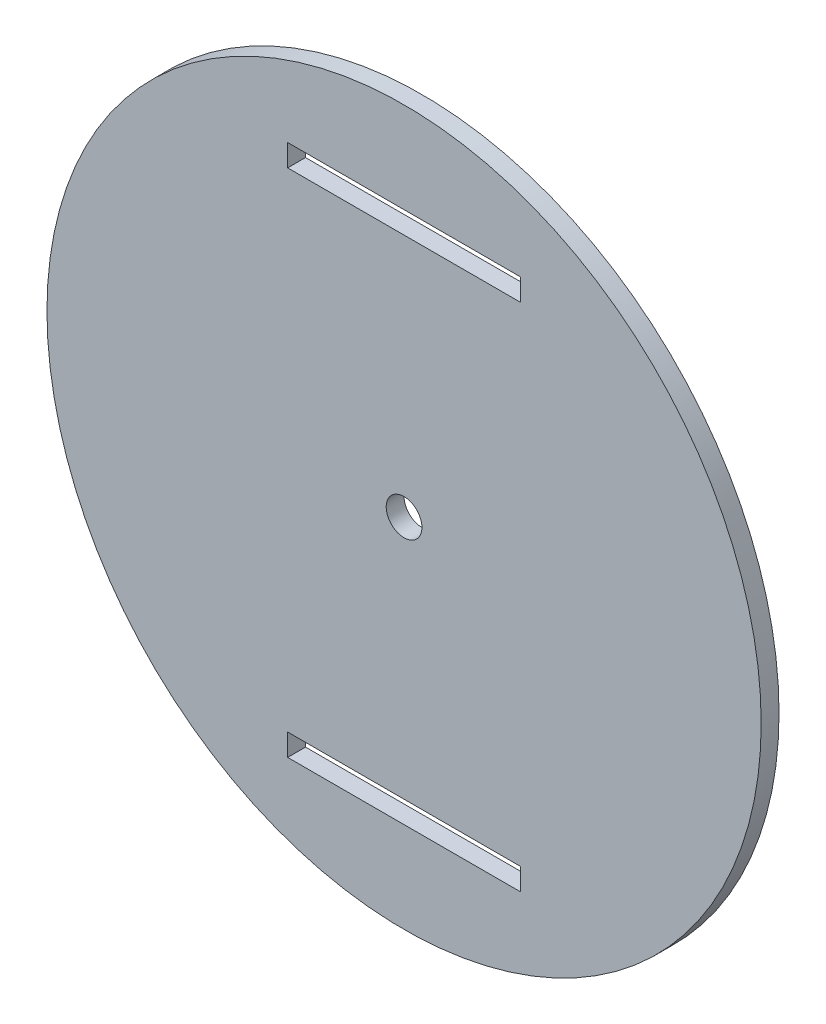
ISO-10303-21;
HEADER;
FILE_DESCRIPTION(('STEP AP214'),'2;1');
FILE_NAME('part.step','',(''),(''),'','','');
FILE_SCHEMA(('AUTOMOTIVE_DESIGN { 1 0 10303 214 1 1 1 1 }'));
ENDSEC;
DATA;
#1=APPLICATION_CONTEXT('core data for automotive mechanical design processes');
#2=APPLICATION_PROTOCOL_DEFINITION('international standard','automotive_design',2000,#1);
#3=PRODUCT_CONTEXT('',#1,'mechanical');
#4=PRODUCT('Part','Part','',(#3));
#5=PRODUCT_RELATED_PRODUCT_CATEGORY('part','',(#4));
#6=PRODUCT_DEFINITION_FORMATION('','',#4);
#7=PRODUCT_DEFINITION_CONTEXT('part definition',#1,'design');
#8=PRODUCT_DEFINITION('design','',#6,#7);
#9=PRODUCT_DEFINITION_SHAPE('','',#8);
#10=(LENGTH_UNIT() NAMED_UNIT(*) SI_UNIT(.MILLI.,.METRE.));
#11=(NAMED_UNIT(*) PLANE_ANGLE_UNIT() SI_UNIT($,.RADIAN.));
#12=(NAMED_UNIT(*) SI_UNIT($,.STERADIAN.) SOLID_ANGLE_UNIT());
#13=UNCERTAINTY_MEASURE_WITH_UNIT(LENGTH_MEASURE(1.E-05),#10,'distance_accuracy_value','');
#14=(GEOMETRIC_REPRESENTATION_CONTEXT(3) GLOBAL_UNCERTAINTY_ASSIGNED_CONTEXT((#13)) GLOBAL_UNIT_ASSIGNED_CONTEXT((#10,
#11,#12)) REPRESENTATION_CONTEXT('',''));
#15=CARTESIAN_POINT('',(0.,0.,0.));
#16=DIRECTION('',(0.,0.,1.));
#17=DIRECTION('',(1.,0.,0.));
#18=AXIS2_PLACEMENT_3D('',#15,#16,#17);
#19=CARTESIAN_POINT('',(0.,0.,1.));
#20=DIRECTION('',(0.,0.,-1.));
#21=DIRECTION('',(-1.,0.,0.));
#22=AXIS2_PLACEMENT_3D('',#19,#20,#21);
#23=CYLINDRICAL_SURFACE('',#22,20.);
#24=CARTESIAN_POINT('',(0.,0.,1.));
#25=DIRECTION('',(0.,0.,1.));
#26=DIRECTION('',(1.,0.,0.));
#27=AXIS2_PLACEMENT_3D('',#24,#25,#26);
#28=CIRCLE('',#27,20.);
#29=CARTESIAN_POINT('',(20.,0.,1.));
#30=VERTEX_POINT('',#29);
#31=EDGE_CURVE('E11',#30,#30,#28,.T.);
#32=ORIENTED_EDGE('',*,*,#31,.F.);
#33=EDGE_LOOP('',(#32));
#34=FACE_BOUND('',#33,.T.);
#35=CARTESIAN_POINT('',(0.,0.,0.));
#36=DIRECTION('',(0.,0.,1.));
#37=DIRECTION('',(1.,0.,0.));
#38=AXIS2_PLACEMENT_3D('',#35,#36,#37);
#39=CIRCLE('',#38,20.);
#40=CARTESIAN_POINT('',(20.,0.,0.));
#41=VERTEX_POINT('',#40);
#42=EDGE_CURVE('E37',#41,#41,#39,.T.);
#43=ORIENTED_EDGE('',*,*,#42,.T.);
#44=EDGE_LOOP('',(#43));
#45=FACE_BOUND('',#44,.T.);
#46=ADVANCED_FACE('F34',(#34,#45),#23,.T.);
#47=CARTESIAN_POINT('',(0.,0.,1.));
#48=DIRECTION('',(0.,0.,1.));
#49=DIRECTION('',(1.,0.,0.));
#50=AXIS2_PLACEMENT_3D('',#47,#48,#49);
#51=PLANE('',#50);
#52=CARTESIAN_POINT('',(0.,0.,1.));
#53=DIRECTION('',(0.,0.,1.));
#54=DIRECTION('',(1.,0.,0.));
#55=AXIS2_PLACEMENT_3D('',#52,#53,#54);
#56=CIRCLE('',#55,1.);
#57=CARTESIAN_POINT('',(1.,0.,1.));
#58=VERTEX_POINT('',#57);
#59=EDGE_CURVE('E125',#58,#58,#56,.T.);
#60=ORIENTED_EDGE('',*,*,#59,.F.);
#61=EDGE_LOOP('',(#60));
#62=FACE_BOUND('',#61,.T.);
#63=DIRECTION('',(0.,1.,0.));
#64=VECTOR('',#63,1.);
#65=CARTESIAN_POINT('',(6.51867331266451,14.9118149169536,1.));
#66=LINE('',#65,#64);
#67=CARTESIAN_POINT('',(6.51867331266451,13.6808208149912,1.));
#68=VERTEX_POINT('',#67);
#69=CARTESIAN_POINT('',(6.51867331266451,14.9118149169536,1.));
#70=VERTEX_POINT('',#69);
#71=EDGE_CURVE('E48',#68,#70,#66,.T.);
#72=ORIENTED_EDGE('',*,*,#71,.F.);
#73=DIRECTION('',(1.,0.,0.));
#74=VECTOR('',#73,1.);
#75=CARTESIAN_POINT('',(-6.51867331266451,13.6808208149912,1.));
#76=LINE('',#75,#74);
#77=CARTESIAN_POINT('',(-6.51867331266451,13.6808208149912,1.));
#78=VERTEX_POINT('',#77);
#79=EDGE_CURVE('E119',#78,#68,#76,.T.);
#80=ORIENTED_EDGE('',*,*,#79,.F.);
#81=DIRECTION('',(0.,-1.,0.));
#82=VECTOR('',#81,1.);
#83=CARTESIAN_POINT('',(-6.51867331266451,14.9118149169536,1.));
#84=LINE('',#83,#82);
#85=CARTESIAN_POINT('',(-6.51867331266451,14.9118149169536,1.));
#86=VERTEX_POINT('',#85);
#87=EDGE_CURVE('E122',#86,#78,#84,.T.);
#88=ORIENTED_EDGE('',*,*,#87,.F.);
#89=DIRECTION('',(-1.,0.,0.));
#90=VECTOR('',#89,1.);
#91=CARTESIAN_POINT('',(-6.51867331266451,14.9118149169536,1.));
#92=LINE('',#91,#90);
#93=EDGE_CURVE('E131',#70,#86,#92,.T.);
#94=ORIENTED_EDGE('',*,*,#93,.F.);
#95=EDGE_LOOP('',(#72,#80,#88,#94));
#96=FACE_BOUND('',#95,.T.);
#97=DIRECTION('',(0.,-1.,0.));
#98=VECTOR('',#97,1.);
#99=CARTESIAN_POINT('',(-6.51867331266451,-14.9118149169536,1.));
#100=LINE('',#99,#98);
#101=CARTESIAN_POINT('',(-6.51867331266451,-13.6808208149912,1.));
#102=VERTEX_POINT('',#101);
#103=CARTESIAN_POINT('',(-6.51867331266451,-14.9118149169536,1.));
#104=VERTEX_POINT('',#103);
#105=EDGE_CURVE('E56',#102,#104,#100,.T.);
#106=ORIENTED_EDGE('',*,*,#105,.F.);
#107=DIRECTION('',(-1.,0.,0.));
#108=VECTOR('',#107,1.);
#109=CARTESIAN_POINT('',(-6.51867331266451,-13.6808208149912,1.));
#110=LINE('',#109,#108);
#111=CARTESIAN_POINT('',(6.51867331266451,-13.6808208149912,1.));
#112=VERTEX_POINT('',#111);
#113=EDGE_CURVE('E145',#112,#102,#110,.T.);
#114=ORIENTED_EDGE('',*,*,#113,.F.);
#115=DIRECTION('',(0.,1.,0.));
#116=VECTOR('',#115,1.);
#117=CARTESIAN_POINT('',(6.51867331266451,-14.9118149169536,1.));
#118=LINE('',#117,#116);
#119=CARTESIAN_POINT('',(6.51867331266451,-14.9118149169536,1.));
#120=VERTEX_POINT('',#119);
#121=EDGE_CURVE('E160',#120,#112,#118,.T.);
#122=ORIENTED_EDGE('',*,*,#121,.F.);
#123=DIRECTION('',(1.,0.,0.));
#124=VECTOR('',#123,1.);
#125=CARTESIAN_POINT('',(-6.51867331266451,-14.9118149169536,1.));
#126=LINE('',#125,#124);
#127=EDGE_CURVE('E156',#104,#120,#126,.T.);
#128=ORIENTED_EDGE('',*,*,#127,.F.);
#129=EDGE_LOOP('',(#106,#114,#122,#128));
#130=FACE_BOUND('',#129,.T.);
#131=ORIENTED_EDGE('',*,*,#31,.T.);
#132=EDGE_LOOP('',(#131));
#133=FACE_BOUND('',#132,.T.);
#134=ADVANCED_FACE('F178',(#62,#96,#130,#133),#51,.T.);
#135=CARTESIAN_POINT('',(0.,0.,0.));
#136=DIRECTION('',(0.,0.,1.));
#137=DIRECTION('',(1.,0.,0.));
#138=AXIS2_PLACEMENT_3D('',#135,#136,#137);
#139=PLANE('',#138);
#140=CARTESIAN_POINT('',(0.,0.,0.));
#141=DIRECTION('',(0.,0.,1.));
#142=DIRECTION('',(1.,0.,0.));
#143=AXIS2_PLACEMENT_3D('',#140,#141,#142);
#144=CIRCLE('',#143,1.);
#145=CARTESIAN_POINT('',(1.,0.,0.));
#146=VERTEX_POINT('',#145);
#147=EDGE_CURVE('E157',#146,#146,#144,.T.);
#148=ORIENTED_EDGE('',*,*,#147,.T.);
#149=EDGE_LOOP('',(#148));
#150=FACE_BOUND('',#149,.T.);
#151=DIRECTION('',(1.,0.,0.));
#152=VECTOR('',#151,1.);
#153=CARTESIAN_POINT('',(-6.51867331266451,13.6808208149912,0.));
#154=LINE('',#153,#152);
#155=CARTESIAN_POINT('',(-6.51867331266451,13.6808208149912,0.));
#156=VERTEX_POINT('',#155);
#157=CARTESIAN_POINT('',(6.51867331266451,13.6808208149912,0.));
#158=VERTEX_POINT('',#157);
#159=EDGE_CURVE('E106',#156,#158,#154,.T.);
#160=ORIENTED_EDGE('',*,*,#159,.T.);
#161=DIRECTION('',(0.,1.,0.));
#162=VECTOR('',#161,1.);
#163=CARTESIAN_POINT('',(6.51867331266451,14.9118149169536,0.));
#164=LINE('',#163,#162);
#165=CARTESIAN_POINT('',(6.51867331266451,14.9118149169536,0.));
#166=VERTEX_POINT('',#165);
#167=EDGE_CURVE('E100',#158,#166,#164,.T.);
#168=ORIENTED_EDGE('',*,*,#167,.T.);
#169=DIRECTION('',(-1.,0.,0.));
#170=VECTOR('',#169,1.);
#171=CARTESIAN_POINT('',(-6.51867331266451,14.9118149169536,0.));
#172=LINE('',#171,#170);
#173=CARTESIAN_POINT('',(-6.51867331266451,14.9118149169536,0.));
#174=VERTEX_POINT('',#173);
#175=EDGE_CURVE('E110',#166,#174,#172,.T.);
#176=ORIENTED_EDGE('',*,*,#175,.T.);
#177=DIRECTION('',(0.,-1.,0.));
#178=VECTOR('',#177,1.);
#179=CARTESIAN_POINT('',(-6.51867331266451,14.9118149169536,0.));
#180=LINE('',#179,#178);
#181=EDGE_CURVE('E114',#174,#156,#180,.T.);
#182=ORIENTED_EDGE('',*,*,#181,.T.);
#183=EDGE_LOOP('',(#160,#168,#176,#182));
#184=FACE_BOUND('',#183,.T.);
#185=DIRECTION('',(-1.,0.,0.));
#186=VECTOR('',#185,1.);
#187=CARTESIAN_POINT('',(-6.51867331266451,-13.6808208149912,0.));
#188=LINE('',#187,#186);
#189=CARTESIAN_POINT('',(6.51867331266451,-13.6808208149912,0.));
#190=VERTEX_POINT('',#189);
#191=CARTESIAN_POINT('',(-6.51867331266451,-13.6808208149912,0.));
#192=VERTEX_POINT('',#191);
#193=EDGE_CURVE('E151',#190,#192,#188,.T.);
#194=ORIENTED_EDGE('',*,*,#193,.T.);
#195=DIRECTION('',(0.,-1.,0.));
#196=VECTOR('',#195,1.);
#197=CARTESIAN_POINT('',(-6.51867331266451,-14.9118149169536,0.));
#198=LINE('',#197,#196);
#199=CARTESIAN_POINT('',(-6.51867331266451,-14.9118149169536,0.));
#200=VERTEX_POINT('',#199);
#201=EDGE_CURVE('E141',#192,#200,#198,.T.);
#202=ORIENTED_EDGE('',*,*,#201,.T.);
#203=DIRECTION('',(1.,0.,0.));
#204=VECTOR('',#203,1.);
#205=CARTESIAN_POINT('',(-6.51867331266451,-14.9118149169536,0.));
#206=LINE('',#205,#204);
#207=CARTESIAN_POINT('',(6.51867331266451,-14.9118149169536,0.));
#208=VERTEX_POINT('',#207);
#209=EDGE_CURVE('E144',#200,#208,#206,.T.);
#210=ORIENTED_EDGE('',*,*,#209,.T.);
#211=DIRECTION('',(0.,1.,0.));
#212=VECTOR('',#211,1.);
#213=CARTESIAN_POINT('',(6.51867331266451,-14.9118149169536,0.));
#214=LINE('',#213,#212);
#215=EDGE_CURVE('E148',#208,#190,#214,.T.);
#216=ORIENTED_EDGE('',*,*,#215,.T.);
#217=EDGE_LOOP('',(#194,#202,#210,#216));
#218=FACE_BOUND('',#217,.T.);
#219=ORIENTED_EDGE('',*,*,#42,.F.);
#220=EDGE_LOOP('',(#219));
#221=FACE_BOUND('',#220,.T.);
#222=ADVANCED_FACE('F116',(#150,#184,#218,#221),#139,.F.);
#223=CARTESIAN_POINT('',(-6.51867331266451,-14.9118149169536,0.));
#224=DIRECTION('',(-1.,0.,0.));
#225=DIRECTION('',(0.,0.,1.));
#226=AXIS2_PLACEMENT_3D('',#223,#224,#225);
#227=PLANE('',#226);
#228=ORIENTED_EDGE('',*,*,#105,.T.);
#229=DIRECTION('',(0.,0.,1.));
#230=VECTOR('',#229,1.);
#231=CARTESIAN_POINT('',(-6.51867331266451,-14.9118149169536,0.));
#232=LINE('',#231,#230);
#233=EDGE_CURVE('E154',#200,#104,#232,.T.);
#234=ORIENTED_EDGE('',*,*,#233,.F.);
#235=ORIENTED_EDGE('',*,*,#201,.F.);
#236=DIRECTION('',(0.,0.,1.));
#237=VECTOR('',#236,1.);
#238=CARTESIAN_POINT('',(-6.51867331266451,-13.6808208149912,0.));
#239=LINE('',#238,#237);
#240=EDGE_CURVE('E132',#192,#102,#239,.T.);
#241=ORIENTED_EDGE('',*,*,#240,.T.);
#242=EDGE_LOOP('',(#228,#234,#235,#241));
#243=FACE_BOUND('',#242,.T.);
#244=ADVANCED_FACE('F185',(#243),#227,.F.);
#245=CARTESIAN_POINT('',(-6.51867331266451,-13.6808208149912,0.));
#246=DIRECTION('',(0.,1.,0.));
#247=DIRECTION('',(0.,0.,1.));
#248=AXIS2_PLACEMENT_3D('',#245,#246,#247);
#249=PLANE('',#248);
#250=ORIENTED_EDGE('',*,*,#113,.T.);
#251=ORIENTED_EDGE('',*,*,#240,.F.);
#252=ORIENTED_EDGE('',*,*,#193,.F.);
#253=DIRECTION('',(0.,0.,1.));
#254=VECTOR('',#253,1.);
#255=CARTESIAN_POINT('',(6.51867331266451,-13.6808208149912,0.));
#256=LINE('',#255,#254);
#257=EDGE_CURVE('E166',#190,#112,#256,.T.);
#258=ORIENTED_EDGE('',*,*,#257,.T.);
#259=EDGE_LOOP('',(#250,#251,#252,#258));
#260=FACE_BOUND('',#259,.T.);
#261=ADVANCED_FACE('F187',(#260),#249,.F.);
#262=CARTESIAN_POINT('',(6.51867331266451,-14.9118149169536,0.));
#263=DIRECTION('',(1.,0.,0.));
#264=DIRECTION('',(0.,0.,-1.));
#265=AXIS2_PLACEMENT_3D('',#262,#263,#264);
#266=PLANE('',#265);
#267=ORIENTED_EDGE('',*,*,#121,.T.);
#268=ORIENTED_EDGE('',*,*,#257,.F.);
#269=ORIENTED_EDGE('',*,*,#215,.F.);
#270=DIRECTION('',(0.,0.,1.));
#271=VECTOR('',#270,1.);
#272=CARTESIAN_POINT('',(6.51867331266451,-14.9118149169536,0.));
#273=LINE('',#272,#271);
#274=EDGE_CURVE('E168',#208,#120,#273,.T.);
#275=ORIENTED_EDGE('',*,*,#274,.T.);
#276=EDGE_LOOP('',(#267,#268,#269,#275));
#277=FACE_BOUND('',#276,.T.);
#278=ADVANCED_FACE('F182',(#277),#266,.F.);
#279=CARTESIAN_POINT('',(-6.51867331266451,-14.9118149169536,0.));
#280=DIRECTION('',(0.,-1.,0.));
#281=DIRECTION('',(0.,0.,-1.));
#282=AXIS2_PLACEMENT_3D('',#279,#280,#281);
#283=PLANE('',#282);
#284=ORIENTED_EDGE('',*,*,#127,.T.);
#285=ORIENTED_EDGE('',*,*,#274,.F.);
#286=ORIENTED_EDGE('',*,*,#209,.F.);
#287=ORIENTED_EDGE('',*,*,#233,.T.);
#288=EDGE_LOOP('',(#284,#285,#286,#287));
#289=FACE_BOUND('',#288,.T.);
#290=ADVANCED_FACE('F173',(#289),#283,.F.);
#291=CARTESIAN_POINT('',(6.51867331266451,14.9118149169536,0.));
#292=DIRECTION('',(1.,0.,0.));
#293=DIRECTION('',(0.,0.,-1.));
#294=AXIS2_PLACEMENT_3D('',#291,#292,#293);
#295=PLANE('',#294);
#296=ORIENTED_EDGE('',*,*,#71,.T.);
#297=DIRECTION('',(0.,0.,1.));
#298=VECTOR('',#297,1.);
#299=CARTESIAN_POINT('',(6.51867331266451,14.9118149169536,0.));
#300=LINE('',#299,#298);
#301=EDGE_CURVE('E96',#166,#70,#300,.T.);
#302=ORIENTED_EDGE('',*,*,#301,.F.);
#303=ORIENTED_EDGE('',*,*,#167,.F.);
#304=DIRECTION('',(0.,0.,1.));
#305=VECTOR('',#304,1.);
#306=CARTESIAN_POINT('',(6.51867331266451,13.6808208149912,0.));
#307=LINE('',#306,#305);
#308=EDGE_CURVE('E136',#158,#68,#307,.T.);
#309=ORIENTED_EDGE('',*,*,#308,.T.);
#310=EDGE_LOOP('',(#296,#302,#303,#309));
#311=FACE_BOUND('',#310,.T.);
#312=ADVANCED_FACE('F98',(#311),#295,.F.);
#313=CARTESIAN_POINT('',(-6.51867331266451,13.6808208149912,0.));
#314=DIRECTION('',(0.,-1.,0.));
#315=DIRECTION('',(0.,0.,-1.));
#316=AXIS2_PLACEMENT_3D('',#313,#314,#315);
#317=PLANE('',#316);
#318=ORIENTED_EDGE('',*,*,#79,.T.);
#319=ORIENTED_EDGE('',*,*,#308,.F.);
#320=ORIENTED_EDGE('',*,*,#159,.F.);
#321=DIRECTION('',(0.,0.,1.));
#322=VECTOR('',#321,1.);
#323=CARTESIAN_POINT('',(-6.51867331266451,13.6808208149912,0.));
#324=LINE('',#323,#322);
#325=EDGE_CURVE('E138',#156,#78,#324,.T.);
#326=ORIENTED_EDGE('',*,*,#325,.T.);
#327=EDGE_LOOP('',(#318,#319,#320,#326));
#328=FACE_BOUND('',#327,.T.);
#329=ADVANCED_FACE('F218',(#328),#317,.F.);
#330=CARTESIAN_POINT('',(-6.51867331266451,14.9118149169536,0.));
#331=DIRECTION('',(-1.,0.,0.));
#332=DIRECTION('',(0.,0.,1.));
#333=AXIS2_PLACEMENT_3D('',#330,#331,#332);
#334=PLANE('',#333);
#335=ORIENTED_EDGE('',*,*,#87,.T.);
#336=ORIENTED_EDGE('',*,*,#325,.F.);
#337=ORIENTED_EDGE('',*,*,#181,.F.);
#338=DIRECTION('',(0.,0.,1.));
#339=VECTOR('',#338,1.);
#340=CARTESIAN_POINT('',(-6.51867331266451,14.9118149169536,0.));
#341=LINE('',#340,#339);
#342=EDGE_CURVE('E105',#174,#86,#341,.T.);
#343=ORIENTED_EDGE('',*,*,#342,.T.);
#344=EDGE_LOOP('',(#335,#336,#337,#343));
#345=FACE_BOUND('',#344,.T.);
#346=ADVANCED_FACE('F222',(#345),#334,.F.);
#347=CARTESIAN_POINT('',(-6.51867331266451,14.9118149169536,0.));
#348=DIRECTION('',(0.,1.,0.));
#349=DIRECTION('',(0.,0.,1.));
#350=AXIS2_PLACEMENT_3D('',#347,#348,#349);
#351=PLANE('',#350);
#352=ORIENTED_EDGE('',*,*,#93,.T.);
#353=ORIENTED_EDGE('',*,*,#342,.F.);
#354=ORIENTED_EDGE('',*,*,#175,.F.);
#355=ORIENTED_EDGE('',*,*,#301,.T.);
#356=EDGE_LOOP('',(#352,#353,#354,#355));
#357=FACE_BOUND('',#356,.T.);
#358=ADVANCED_FACE('F111',(#357),#351,.F.);
#359=CARTESIAN_POINT('',(0.,0.,0.));
#360=DIRECTION('',(0.,0.,1.));
#361=DIRECTION('',(1.,0.,0.));
#362=AXIS2_PLACEMENT_3D('',#359,#360,#361);
#363=CYLINDRICAL_SURFACE('',#362,1.);
#364=ORIENTED_EDGE('',*,*,#147,.F.);
#365=EDGE_LOOP('',(#364));
#366=FACE_BOUND('',#365,.T.);
#367=ORIENTED_EDGE('',*,*,#59,.T.);
#368=EDGE_LOOP('',(#367));
#369=FACE_BOUND('',#368,.T.);
#370=ADVANCED_FACE('F228',(#366,#369),#363,.F.);
#371=CLOSED_SHELL('',(#46,#134,#222,#244,#261,#278,#290,#312,#329,#346,#358,#370));
#372=MANIFOLD_SOLID_BREP('B2',#371);
#373=ADVANCED_BREP_SHAPE_REPRESENTATION('',(#18,#372),#14);
#374=SHAPE_DEFINITION_REPRESENTATION(#9,#373);
ENDSEC;
END-ISO-10303-21;
